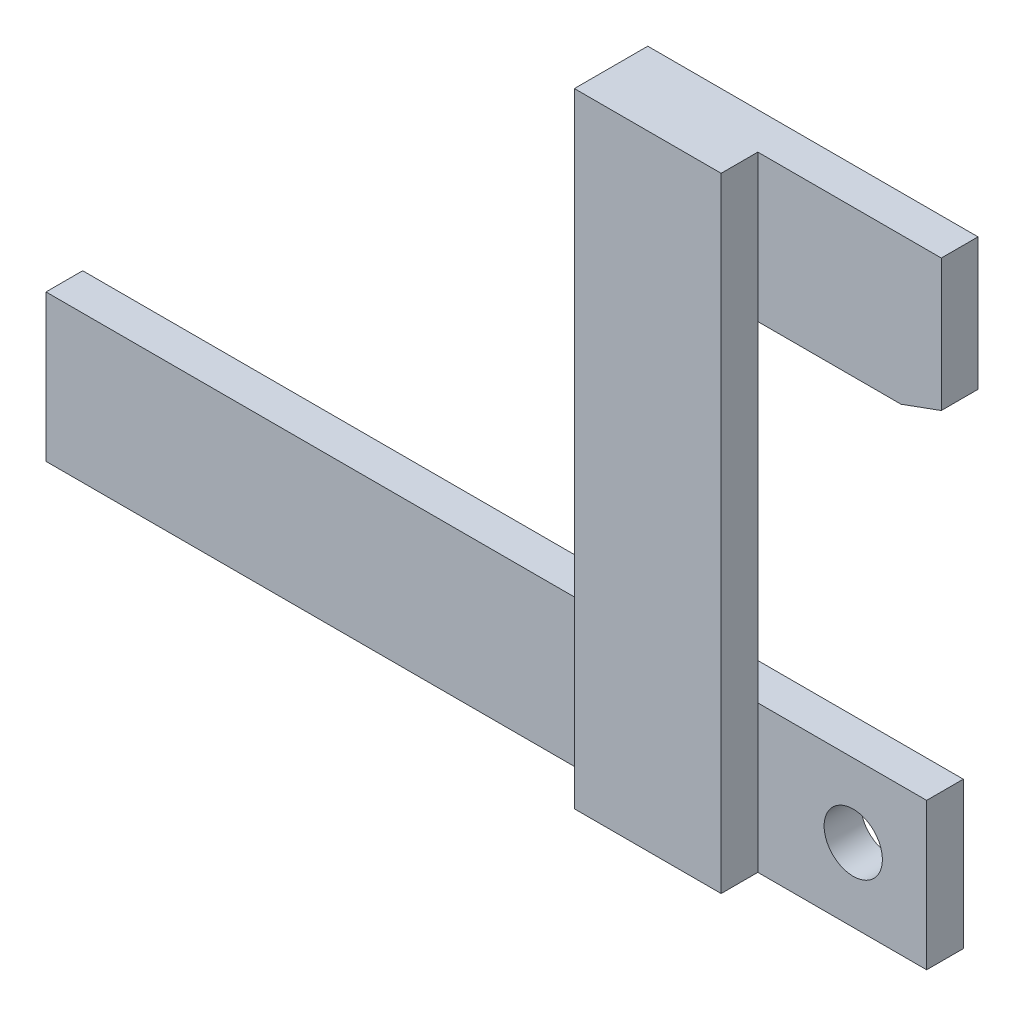
ISO-10303-21;
HEADER;
FILE_DESCRIPTION(('STEP AP214'),'2;1');
FILE_NAME('part.step','',(''),(''),'','','');
FILE_SCHEMA(('AUTOMOTIVE_DESIGN { 1 0 10303 214 1 1 1 1 }'));
ENDSEC;
DATA;
#1=APPLICATION_CONTEXT('core data for automotive mechanical design processes');
#2=APPLICATION_PROTOCOL_DEFINITION('international standard','automotive_design',2000,#1);
#3=PRODUCT_CONTEXT('',#1,'mechanical');
#4=PRODUCT('Part','Part','',(#3));
#5=PRODUCT_RELATED_PRODUCT_CATEGORY('part','',(#4));
#6=PRODUCT_DEFINITION_FORMATION('','',#4);
#7=PRODUCT_DEFINITION_CONTEXT('part definition',#1,'design');
#8=PRODUCT_DEFINITION('design','',#6,#7);
#9=PRODUCT_DEFINITION_SHAPE('','',#8);
#10=(LENGTH_UNIT() NAMED_UNIT(*) SI_UNIT(.MILLI.,.METRE.));
#11=(NAMED_UNIT(*) PLANE_ANGLE_UNIT() SI_UNIT($,.RADIAN.));
#12=(NAMED_UNIT(*) SI_UNIT($,.STERADIAN.) SOLID_ANGLE_UNIT());
#13=UNCERTAINTY_MEASURE_WITH_UNIT(LENGTH_MEASURE(1.E-05),#10,'distance_accuracy_value','');
#14=(GEOMETRIC_REPRESENTATION_CONTEXT(3) GLOBAL_UNCERTAINTY_ASSIGNED_CONTEXT((#13)) GLOBAL_UNIT_ASSIGNED_CONTEXT((#10,
#11,#12)) REPRESENTATION_CONTEXT('',''));
#15=CARTESIAN_POINT('',(0.,0.,0.));
#16=DIRECTION('',(0.,0.,1.));
#17=DIRECTION('',(1.,0.,0.));
#18=AXIS2_PLACEMENT_3D('',#15,#16,#17);
#19=CARTESIAN_POINT('',(46.9900000000001,95.25,6.35));
#20=DIRECTION('',(0.,0.,1.));
#21=DIRECTION('',(1.,0.,0.));
#22=AXIS2_PLACEMENT_3D('',#19,#20,#21);
#23=PLANE('',#22);
#24=DIRECTION('',(-1.,0.,0.));
#25=VECTOR('',#24,1.);
#26=CARTESIAN_POINT('',(21.5900000000001,69.85,6.35));
#27=LINE('',#26,#25);
#28=CARTESIAN_POINT('',(46.9900000000001,69.85,6.35));
#29=VERTEX_POINT('',#28);
#30=CARTESIAN_POINT('',(21.5900000000001,69.85,6.35));
#31=VERTEX_POINT('',#30);
#32=EDGE_CURVE('E158',#29,#31,#27,.T.);
#33=ORIENTED_EDGE('',*,*,#32,.F.);
#34=DIRECTION('',(0.,1.,0.));
#35=VECTOR('',#34,1.);
#36=CARTESIAN_POINT('',(46.9900000000001,-12.7,6.35));
#37=LINE('',#36,#35);
#38=CARTESIAN_POINT('',(46.9900000000001,12.7,6.35));
#39=VERTEX_POINT('',#38);
#40=EDGE_CURVE('E176',#39,#29,#37,.T.);
#41=ORIENTED_EDGE('',*,*,#40,.F.);
#42=DIRECTION('',(-1.,0.,0.));
#43=VECTOR('',#42,1.);
#44=CARTESIAN_POINT('',(-76.1999999999999,12.7,6.35));
#45=LINE('',#44,#43);
#46=CARTESIAN_POINT('',(21.5900000000001,12.7,6.35));
#47=VERTEX_POINT('',#46);
#48=EDGE_CURVE('E248',#39,#47,#45,.T.);
#49=ORIENTED_EDGE('',*,*,#48,.T.);
#50=DIRECTION('',(0.,-1.,0.));
#51=VECTOR('',#50,1.);
#52=CARTESIAN_POINT('',(21.5900000000001,-12.7,6.35));
#53=LINE('',#52,#51);
#54=EDGE_CURVE('E181',#31,#47,#53,.T.);
#55=ORIENTED_EDGE('',*,*,#54,.F.);
#56=EDGE_LOOP('',(#33,#41,#49,#55));
#57=FACE_BOUND('',#56,.T.);
#58=ADVANCED_FACE('F33',(#57),#23,.F.);
#59=CARTESIAN_POINT('',(76.2,12.7,6.35));
#60=DIRECTION('',(0.,0.,-1.));
#61=DIRECTION('',(-1.,0.,0.));
#62=AXIS2_PLACEMENT_3D('',#59,#60,#61);
#63=PLANE('',#62);
#64=CARTESIAN_POINT('',(63.5000000000001,0.,6.35));
#65=DIRECTION('',(0.,0.,1.));
#66=DIRECTION('',(1.,0.,0.));
#67=AXIS2_PLACEMENT_3D('',#64,#65,#66);
#68=CIRCLE('',#67,5.0419);
#69=CARTESIAN_POINT('',(68.5419000000001,0.,6.35));
#70=VERTEX_POINT('',#69);
#71=EDGE_CURVE('E453',#70,#70,#68,.T.);
#72=ORIENTED_EDGE('',*,*,#71,.F.);
#73=EDGE_LOOP('',(#72));
#74=FACE_BOUND('',#73,.T.);
#75=CARTESIAN_POINT('',(46.99,-12.7,6.35));
#76=VERTEX_POINT('',#75);
#77=EDGE_CURVE('E190',#76,#39,#37,.T.);
#78=ORIENTED_EDGE('',*,*,#77,.F.);
#79=DIRECTION('',(1.,0.,0.));
#80=VECTOR('',#79,1.);
#81=CARTESIAN_POINT('',(-76.1999999999999,-12.7,6.35));
#82=LINE('',#81,#80);
#83=CARTESIAN_POINT('',(76.2000000000001,-12.7,6.35));
#84=VERTEX_POINT('',#83);
#85=EDGE_CURVE('E217',#76,#84,#82,.T.);
#86=ORIENTED_EDGE('',*,*,#85,.T.);
#87=DIRECTION('',(0.,1.,0.));
#88=VECTOR('',#87,1.);
#89=CARTESIAN_POINT('',(76.2000000000001,-12.7,6.35));
#90=LINE('',#89,#88);
#91=CARTESIAN_POINT('',(76.2000000000001,12.7,6.35));
#92=VERTEX_POINT('',#91);
#93=EDGE_CURVE('E239',#84,#92,#90,.T.);
#94=ORIENTED_EDGE('',*,*,#93,.T.);
#95=EDGE_CURVE('E244',#92,#39,#45,.T.);
#96=ORIENTED_EDGE('',*,*,#95,.T.);
#97=EDGE_LOOP('',(#78,#86,#94,#96));
#98=FACE_BOUND('',#97,.T.);
#99=ADVANCED_FACE('F281',(#74,#98),#63,.F.);
#100=CARTESIAN_POINT('',(21.5900000000001,-12.7,6.35));
#101=VERTEX_POINT('',#100);
#102=EDGE_CURVE('E205',#47,#101,#53,.T.);
#103=ORIENTED_EDGE('',*,*,#102,.F.);
#104=CARTESIAN_POINT('',(-76.1999999999999,12.7,6.35));
#105=VERTEX_POINT('',#104);
#106=EDGE_CURVE('E242',#47,#105,#45,.T.);
#107=ORIENTED_EDGE('',*,*,#106,.T.);
#108=DIRECTION('',(0.,-1.,0.));
#109=VECTOR('',#108,1.);
#110=CARTESIAN_POINT('',(-76.1999999999999,-12.7,6.35));
#111=LINE('',#110,#109);
#112=CARTESIAN_POINT('',(-76.1999999999999,-12.7,6.35));
#113=VERTEX_POINT('',#112);
#114=EDGE_CURVE('E247',#105,#113,#111,.T.);
#115=ORIENTED_EDGE('',*,*,#114,.T.);
#116=EDGE_CURVE('E225',#113,#101,#82,.T.);
#117=ORIENTED_EDGE('',*,*,#116,.T.);
#118=EDGE_LOOP('',(#103,#107,#115,#117));
#119=FACE_BOUND('',#118,.T.);
#120=ADVANCED_FACE('F309',(#119),#63,.F.);
#121=CARTESIAN_POINT('',(76.2000000000001,-12.7,6.35));
#122=DIRECTION('',(-1.,0.,0.));
#123=DIRECTION('',(0.,0.,1.));
#124=AXIS2_PLACEMENT_3D('',#121,#122,#123);
#125=PLANE('',#124);
#126=DIRECTION('',(0.,1.,0.));
#127=VECTOR('',#126,1.);
#128=CARTESIAN_POINT('',(76.2000000000001,-12.7,0.));
#129=LINE('',#128,#127);
#130=CARTESIAN_POINT('',(76.2000000000001,-12.7,0.));
#131=VERTEX_POINT('',#130);
#132=CARTESIAN_POINT('',(76.2000000000001,12.7,0.));
#133=VERTEX_POINT('',#132);
#134=EDGE_CURVE('E233',#131,#133,#129,.T.);
#135=ORIENTED_EDGE('',*,*,#134,.T.);
#136=DIRECTION('',(0.,0.,-1.));
#137=VECTOR('',#136,1.);
#138=CARTESIAN_POINT('',(76.2000000000001,12.7,6.35));
#139=LINE('',#138,#137);
#140=EDGE_CURVE('E209',#92,#133,#139,.T.);
#141=ORIENTED_EDGE('',*,*,#140,.F.);
#142=ORIENTED_EDGE('',*,*,#93,.F.);
#143=DIRECTION('',(0.,0.,-1.));
#144=VECTOR('',#143,1.);
#145=CARTESIAN_POINT('',(76.2000000000001,-12.7,6.35));
#146=LINE('',#145,#144);
#147=EDGE_CURVE('E252',#84,#131,#146,.T.);
#148=ORIENTED_EDGE('',*,*,#147,.T.);
#149=EDGE_LOOP('',(#135,#141,#142,#148));
#150=FACE_BOUND('',#149,.T.);
#151=ADVANCED_FACE('F279',(#150),#125,.F.);
#152=CARTESIAN_POINT('',(-76.1999999999999,12.7,6.35));
#153=DIRECTION('',(0.,-1.,0.));
#154=DIRECTION('',(0.,0.,-1.));
#155=AXIS2_PLACEMENT_3D('',#152,#153,#154);
#156=PLANE('',#155);
#157=DIRECTION('',(-1.,0.,0.));
#158=VECTOR('',#157,1.);
#159=CARTESIAN_POINT('',(-76.1999999999999,12.7,0.));
#160=LINE('',#159,#158);
#161=CARTESIAN_POINT('',(-76.1999999999999,12.7,0.));
#162=VERTEX_POINT('',#161);
#163=EDGE_CURVE('E236',#133,#162,#160,.T.);
#164=ORIENTED_EDGE('',*,*,#163,.T.);
#165=DIRECTION('',(0.,0.,-1.));
#166=VECTOR('',#165,1.);
#167=CARTESIAN_POINT('',(-76.1999999999999,12.7,6.35));
#168=LINE('',#167,#166);
#169=EDGE_CURVE('E214',#105,#162,#168,.T.);
#170=ORIENTED_EDGE('',*,*,#169,.F.);
#171=ORIENTED_EDGE('',*,*,#106,.F.);
#172=ORIENTED_EDGE('',*,*,#48,.F.);
#173=ORIENTED_EDGE('',*,*,#95,.F.);
#174=ORIENTED_EDGE('',*,*,#140,.T.);
#175=EDGE_LOOP('',(#164,#170,#171,#172,#173,#174));
#176=FACE_BOUND('',#175,.T.);
#177=ADVANCED_FACE('F264',(#176),#156,.F.);
#178=CARTESIAN_POINT('',(-76.1999999999999,-12.7,6.35));
#179=DIRECTION('',(1.,0.,0.));
#180=DIRECTION('',(0.,0.,-1.));
#181=AXIS2_PLACEMENT_3D('',#178,#179,#180);
#182=PLANE('',#181);
#183=DIRECTION('',(0.,-1.,0.));
#184=VECTOR('',#183,1.);
#185=CARTESIAN_POINT('',(-76.1999999999999,-12.7,0.));
#186=LINE('',#185,#184);
#187=CARTESIAN_POINT('',(-76.1999999999999,-12.7,0.));
#188=VERTEX_POINT('',#187);
#189=EDGE_CURVE('E261',#162,#188,#186,.T.);
#190=ORIENTED_EDGE('',*,*,#189,.T.);
#191=DIRECTION('',(0.,0.,-1.));
#192=VECTOR('',#191,1.);
#193=CARTESIAN_POINT('',(-76.1999999999999,-12.7,6.35));
#194=LINE('',#193,#192);
#195=EDGE_CURVE('E256',#113,#188,#194,.T.);
#196=ORIENTED_EDGE('',*,*,#195,.F.);
#197=ORIENTED_EDGE('',*,*,#114,.F.);
#198=ORIENTED_EDGE('',*,*,#169,.T.);
#199=EDGE_LOOP('',(#190,#196,#197,#198));
#200=FACE_BOUND('',#199,.T.);
#201=ADVANCED_FACE('F272',(#200),#182,.F.);
#202=CARTESIAN_POINT('',(-76.1999999999999,-12.7,6.35));
#203=DIRECTION('',(0.,1.,0.));
#204=DIRECTION('',(0.,0.,1.));
#205=AXIS2_PLACEMENT_3D('',#202,#203,#204);
#206=PLANE('',#205);
#207=DIRECTION('',(1.,0.,0.));
#208=VECTOR('',#207,1.);
#209=CARTESIAN_POINT('',(-76.1999999999999,-12.7,0.));
#210=LINE('',#209,#208);
#211=EDGE_CURVE('E243',#188,#131,#210,.T.);
#212=ORIENTED_EDGE('',*,*,#211,.T.);
#213=ORIENTED_EDGE('',*,*,#147,.F.);
#214=ORIENTED_EDGE('',*,*,#85,.F.);
#215=DIRECTION('',(0.,0.,-1.));
#216=VECTOR('',#215,1.);
#217=CARTESIAN_POINT('',(46.9900000000001,-12.7,12.7));
#218=LINE('',#217,#216);
#219=CARTESIAN_POINT('',(46.9900000000001,-12.7,12.7));
#220=VERTEX_POINT('',#219);
#221=EDGE_CURVE('E186',#220,#76,#218,.T.);
#222=ORIENTED_EDGE('',*,*,#221,.F.);
#223=DIRECTION('',(1.,0.,0.));
#224=VECTOR('',#223,1.);
#225=CARTESIAN_POINT('',(46.9900000000001,-12.7,12.7));
#226=LINE('',#225,#224);
#227=CARTESIAN_POINT('',(21.5900000000001,-12.7,12.7));
#228=VERTEX_POINT('',#227);
#229=EDGE_CURVE('E184',#228,#220,#226,.T.);
#230=ORIENTED_EDGE('',*,*,#229,.F.);
#231=DIRECTION('',(0.,0.,-1.));
#232=VECTOR('',#231,1.);
#233=CARTESIAN_POINT('',(21.5900000000001,-12.7,12.7));
#234=LINE('',#233,#232);
#235=EDGE_CURVE('E141',#228,#101,#234,.T.);
#236=ORIENTED_EDGE('',*,*,#235,.T.);
#237=ORIENTED_EDGE('',*,*,#116,.F.);
#238=ORIENTED_EDGE('',*,*,#195,.T.);
#239=EDGE_LOOP('',(#212,#213,#214,#222,#230,#236,#237,#238));
#240=FACE_BOUND('',#239,.T.);
#241=ADVANCED_FACE('F223',(#240),#206,.F.);
#242=CARTESIAN_POINT('',(76.2,12.7,0.));
#243=DIRECTION('',(0.,0.,-1.));
#244=DIRECTION('',(-1.,0.,0.));
#245=AXIS2_PLACEMENT_3D('',#242,#243,#244);
#246=PLANE('',#245);
#247=CARTESIAN_POINT('',(63.5000000000001,0.,0.));
#248=DIRECTION('',(0.,0.,-1.));
#249=DIRECTION('',(-1.,0.,0.));
#250=AXIS2_PLACEMENT_3D('',#247,#248,#249);
#251=CIRCLE('',#250,5.04189999999999);
#252=CARTESIAN_POINT('',(58.4581000000001,0.,0.));
#253=VERTEX_POINT('',#252);
#254=EDGE_CURVE('E161',#253,#253,#251,.T.);
#255=ORIENTED_EDGE('',*,*,#254,.F.);
#256=EDGE_LOOP('',(#255));
#257=FACE_BOUND('',#256,.T.);
#258=ORIENTED_EDGE('',*,*,#134,.F.);
#259=ORIENTED_EDGE('',*,*,#211,.F.);
#260=ORIENTED_EDGE('',*,*,#189,.F.);
#261=ORIENTED_EDGE('',*,*,#163,.F.);
#262=EDGE_LOOP('',(#258,#259,#260,#261));
#263=FACE_BOUND('',#262,.T.);
#264=ADVANCED_FACE('F275',(#257,#263),#246,.T.);
#265=CARTESIAN_POINT('',(46.9900000000001,-12.7,12.7));
#266=DIRECTION('',(-1.,0.,0.));
#267=DIRECTION('',(0.,0.,1.));
#268=AXIS2_PLACEMENT_3D('',#265,#266,#267);
#269=PLANE('',#268);
#270=ORIENTED_EDGE('',*,*,#77,.T.);
#271=ORIENTED_EDGE('',*,*,#40,.T.);
#272=DIRECTION('',(0.,1.,0.));
#273=VECTOR('',#272,1.);
#274=CARTESIAN_POINT('',(46.9900000000001,-12.7,6.35));
#275=LINE('',#274,#273);
#276=CARTESIAN_POINT('',(46.9900000000001,95.25,6.35));
#277=VERTEX_POINT('',#276);
#278=EDGE_CURVE('E173',#29,#277,#275,.T.);
#279=ORIENTED_EDGE('',*,*,#278,.T.);
#280=DIRECTION('',(0.,0.,-1.));
#281=VECTOR('',#280,1.);
#282=CARTESIAN_POINT('',(46.9900000000001,95.25,12.7));
#283=LINE('',#282,#281);
#284=CARTESIAN_POINT('',(46.9900000000001,95.25,12.7));
#285=VERTEX_POINT('',#284);
#286=EDGE_CURVE('E140',#285,#277,#283,.T.);
#287=ORIENTED_EDGE('',*,*,#286,.F.);
#288=DIRECTION('',(0.,1.,0.));
#289=VECTOR('',#288,1.);
#290=CARTESIAN_POINT('',(46.9900000000001,-12.7,12.7));
#291=LINE('',#290,#289);
#292=EDGE_CURVE('E177',#220,#285,#291,.T.);
#293=ORIENTED_EDGE('',*,*,#292,.F.);
#294=ORIENTED_EDGE('',*,*,#221,.T.);
#295=EDGE_LOOP('',(#270,#271,#279,#287,#293,#294));
#296=FACE_BOUND('',#295,.T.);
#297=ADVANCED_FACE('F283',(#296),#269,.F.);
#298=CARTESIAN_POINT('',(46.9900000000001,95.25,12.7));
#299=DIRECTION('',(0.,-1.,0.));
#300=DIRECTION('',(0.,0.,-1.));
#301=AXIS2_PLACEMENT_3D('',#298,#299,#300);
#302=PLANE('',#301);
#303=ORIENTED_EDGE('',*,*,#286,.T.);
#304=DIRECTION('',(1.,0.,0.));
#305=VECTOR('',#304,1.);
#306=CARTESIAN_POINT('',(21.5900000000001,95.25,6.35));
#307=LINE('',#306,#305);
#308=CARTESIAN_POINT('',(78.7400000000001,95.25,6.35));
#309=VERTEX_POINT('',#308);
#310=EDGE_CURVE('E167',#277,#309,#307,.T.);
#311=ORIENTED_EDGE('',*,*,#310,.T.);
#312=DIRECTION('',(0.,0.,1.));
#313=VECTOR('',#312,1.);
#314=CARTESIAN_POINT('',(78.7400000000001,95.25,0.));
#315=LINE('',#314,#313);
#316=CARTESIAN_POINT('',(78.7400000000001,95.25,0.));
#317=VERTEX_POINT('',#316);
#318=EDGE_CURVE('E148',#317,#309,#315,.T.);
#319=ORIENTED_EDGE('',*,*,#318,.F.);
#320=DIRECTION('',(1.,0.,0.));
#321=VECTOR('',#320,1.);
#322=CARTESIAN_POINT('',(21.5900000000001,95.25,0.));
#323=LINE('',#322,#321);
#324=CARTESIAN_POINT('',(21.5900000000001,95.25,0.));
#325=VERTEX_POINT('',#324);
#326=EDGE_CURVE('E144',#325,#317,#323,.T.);
#327=ORIENTED_EDGE('',*,*,#326,.F.);
#328=DIRECTION('',(0.,0.,-1.));
#329=VECTOR('',#328,1.);
#330=CARTESIAN_POINT('',(21.5900000000001,95.25,12.7));
#331=LINE('',#330,#329);
#332=CARTESIAN_POINT('',(21.5900000000001,95.25,12.7));
#333=VERTEX_POINT('',#332);
#334=EDGE_CURVE('E132',#333,#325,#331,.T.);
#335=ORIENTED_EDGE('',*,*,#334,.F.);
#336=DIRECTION('',(-1.,0.,0.));
#337=VECTOR('',#336,1.);
#338=CARTESIAN_POINT('',(46.9900000000001,95.25,12.7));
#339=LINE('',#338,#337);
#340=EDGE_CURVE('E180',#285,#333,#339,.T.);
#341=ORIENTED_EDGE('',*,*,#340,.F.);
#342=EDGE_LOOP('',(#303,#311,#319,#327,#335,#341));
#343=FACE_BOUND('',#342,.T.);
#344=ADVANCED_FACE('F146',(#343),#302,.F.);
#345=CARTESIAN_POINT('',(21.5900000000001,-12.7,12.7));
#346=DIRECTION('',(1.,0.,0.));
#347=DIRECTION('',(0.,0.,-1.));
#348=AXIS2_PLACEMENT_3D('',#345,#346,#347);
#349=PLANE('',#348);
#350=ORIENTED_EDGE('',*,*,#334,.T.);
#351=DIRECTION('',(0.,1.,0.));
#352=VECTOR('',#351,1.);
#353=CARTESIAN_POINT('',(21.5900000000001,95.25,0.));
#354=LINE('',#353,#352);
#355=CARTESIAN_POINT('',(21.5900000000001,69.85,0.));
#356=VERTEX_POINT('',#355);
#357=EDGE_CURVE('E136',#356,#325,#354,.T.);
#358=ORIENTED_EDGE('',*,*,#357,.F.);
#359=DIRECTION('',(0.,0.,1.));
#360=VECTOR('',#359,1.);
#361=CARTESIAN_POINT('',(21.5900000000001,69.85,0.));
#362=LINE('',#361,#360);
#363=EDGE_CURVE('E166',#356,#31,#362,.T.);
#364=ORIENTED_EDGE('',*,*,#363,.T.);
#365=ORIENTED_EDGE('',*,*,#54,.T.);
#366=ORIENTED_EDGE('',*,*,#102,.T.);
#367=ORIENTED_EDGE('',*,*,#235,.F.);
#368=DIRECTION('',(0.,-1.,0.));
#369=VECTOR('',#368,1.);
#370=CARTESIAN_POINT('',(21.5900000000001,-12.7,12.7));
#371=LINE('',#370,#369);
#372=EDGE_CURVE('E138',#333,#228,#371,.T.);
#373=ORIENTED_EDGE('',*,*,#372,.F.);
#374=EDGE_LOOP('',(#350,#358,#364,#365,#366,#367,#373));
#375=FACE_BOUND('',#374,.T.);
#376=ADVANCED_FACE('F134',(#375),#349,.F.);
#377=CARTESIAN_POINT('',(46.9900000000001,95.25,12.7));
#378=DIRECTION('',(0.,0.,1.));
#379=DIRECTION('',(1.,0.,0.));
#380=AXIS2_PLACEMENT_3D('',#377,#378,#379);
#381=PLANE('',#380);
#382=ORIENTED_EDGE('',*,*,#292,.T.);
#383=ORIENTED_EDGE('',*,*,#340,.T.);
#384=ORIENTED_EDGE('',*,*,#372,.T.);
#385=ORIENTED_EDGE('',*,*,#229,.T.);
#386=EDGE_LOOP('',(#382,#383,#384,#385));
#387=FACE_BOUND('',#386,.T.);
#388=ADVANCED_FACE('F230',(#387),#381,.T.);
#389=CARTESIAN_POINT('',(21.5900000000001,69.85,6.35));
#390=DIRECTION('',(0.,0.,1.));
#391=DIRECTION('',(1.,0.,0.));
#392=AXIS2_PLACEMENT_3D('',#389,#390,#391);
#393=PLANE('',#392);
#394=CARTESIAN_POINT('',(71.7614073545854,69.85,6.35));
#395=VERTEX_POINT('',#394);
#396=EDGE_CURVE('E156',#395,#29,#27,.T.);
#397=ORIENTED_EDGE('',*,*,#396,.F.);
#398=DIRECTION('',(-0.939692620785907,-0.342020143325672,0.));
#399=VECTOR('',#398,1.);
#400=CARTESIAN_POINT('',(27.4589397735735,53.7252204959681,6.35));
#401=LINE('',#400,#399);
#402=CARTESIAN_POINT('',(78.7400000000001,72.39,6.35));
#403=VERTEX_POINT('',#402);
#404=EDGE_CURVE('E55',#395,#403,#401,.F.);
#405=ORIENTED_EDGE('',*,*,#404,.T.);
#406=DIRECTION('',(0.,-1.,0.));
#407=VECTOR('',#406,1.);
#408=CARTESIAN_POINT('',(78.7400000000001,95.25,6.35));
#409=LINE('',#408,#407);
#410=EDGE_CURVE('E169',#309,#403,#409,.T.);
#411=ORIENTED_EDGE('',*,*,#410,.F.);
#412=ORIENTED_EDGE('',*,*,#310,.F.);
#413=ORIENTED_EDGE('',*,*,#278,.F.);
#414=EDGE_LOOP('',(#397,#405,#411,#412,#413));
#415=FACE_BOUND('',#414,.T.);
#416=ADVANCED_FACE('F291',(#415),#393,.T.);
#417=CARTESIAN_POINT('',(78.7400000000001,95.25,0.));
#418=DIRECTION('',(-1.,0.,0.));
#419=DIRECTION('',(0.,0.,1.));
#420=AXIS2_PLACEMENT_3D('',#417,#418,#419);
#421=PLANE('',#420);
#422=ORIENTED_EDGE('',*,*,#410,.T.);
#423=DIRECTION('',(0.,0.,-1.));
#424=VECTOR('',#423,1.);
#425=CARTESIAN_POINT('',(78.7400000000001,72.39,0.));
#426=LINE('',#425,#424);
#427=CARTESIAN_POINT('',(78.7400000000001,72.39,0.));
#428=VERTEX_POINT('',#427);
#429=EDGE_CURVE('E41',#403,#428,#426,.T.);
#430=ORIENTED_EDGE('',*,*,#429,.T.);
#431=DIRECTION('',(0.,-1.,0.));
#432=VECTOR('',#431,1.);
#433=CARTESIAN_POINT('',(78.7400000000001,95.25,0.));
#434=LINE('',#433,#432);
#435=EDGE_CURVE('E150',#317,#428,#434,.T.);
#436=ORIENTED_EDGE('',*,*,#435,.F.);
#437=ORIENTED_EDGE('',*,*,#318,.T.);
#438=EDGE_LOOP('',(#422,#430,#436,#437));
#439=FACE_BOUND('',#438,.T.);
#440=ADVANCED_FACE('F292',(#439),#421,.F.);
#441=CARTESIAN_POINT('',(21.5900000000001,69.85,0.));
#442=DIRECTION('',(0.,1.,0.));
#443=DIRECTION('',(-1.,0.,0.));
#444=AXIS2_PLACEMENT_3D('',#441,#442,#443);
#445=PLANE('',#444);
#446=DIRECTION('',(-1.,0.,0.));
#447=VECTOR('',#446,1.);
#448=CARTESIAN_POINT('',(21.5900000000001,69.85,0.));
#449=LINE('',#448,#447);
#450=CARTESIAN_POINT('',(71.7614073545853,69.85,0.));
#451=VERTEX_POINT('',#450);
#452=EDGE_CURVE('E154',#451,#356,#449,.T.);
#453=ORIENTED_EDGE('',*,*,#452,.F.);
#454=DIRECTION('',(0.,0.,1.));
#455=VECTOR('',#454,1.);
#456=CARTESIAN_POINT('',(71.7614073545854,69.85,0.));
#457=LINE('',#456,#455);
#458=EDGE_CURVE('E202',#451,#395,#457,.T.);
#459=ORIENTED_EDGE('',*,*,#458,.T.);
#460=ORIENTED_EDGE('',*,*,#396,.T.);
#461=ORIENTED_EDGE('',*,*,#32,.T.);
#462=ORIENTED_EDGE('',*,*,#363,.F.);
#463=EDGE_LOOP('',(#453,#459,#460,#461,#462));
#464=FACE_BOUND('',#463,.T.);
#465=ADVANCED_FACE('F290',(#464),#445,.F.);
#466=CARTESIAN_POINT('',(21.5900000000001,69.85,0.));
#467=DIRECTION('',(0.,0.,1.));
#468=DIRECTION('',(1.,0.,0.));
#469=AXIS2_PLACEMENT_3D('',#466,#467,#468);
#470=PLANE('',#469);
#471=ORIENTED_EDGE('',*,*,#435,.T.);
#472=DIRECTION('',(0.939692620785907,0.342020143325672,0.));
#473=VECTOR('',#472,1.);
#474=CARTESIAN_POINT('',(71.7614073545854,69.85,0.));
#475=LINE('',#474,#473);
#476=EDGE_CURVE('E11',#428,#451,#475,.F.);
#477=ORIENTED_EDGE('',*,*,#476,.T.);
#478=ORIENTED_EDGE('',*,*,#452,.T.);
#479=ORIENTED_EDGE('',*,*,#357,.T.);
#480=ORIENTED_EDGE('',*,*,#326,.T.);
#481=EDGE_LOOP('',(#471,#477,#478,#479,#480));
#482=FACE_BOUND('',#481,.T.);
#483=ADVANCED_FACE('F152',(#482),#470,.F.);
#484=CARTESIAN_POINT('',(71.7614073545854,69.85,0.));
#485=DIRECTION('',(-0.342020143325672,0.939692620785907,0.));
#486=DIRECTION('',(-0.939692620785907,-0.342020143325672,0.));
#487=AXIS2_PLACEMENT_3D('',#484,#485,#486);
#488=PLANE('',#487);
#489=ORIENTED_EDGE('',*,*,#476,.F.);
#490=ORIENTED_EDGE('',*,*,#429,.F.);
#491=ORIENTED_EDGE('',*,*,#404,.F.);
#492=ORIENTED_EDGE('',*,*,#458,.F.);
#493=EDGE_LOOP('',(#489,#490,#491,#492));
#494=FACE_BOUND('',#493,.T.);
#495=ADVANCED_FACE('F35',(#494),#488,.F.);
#496=CARTESIAN_POINT('',(63.5000000000001,0.,6.35));
#497=DIRECTION('',(0.,0.,1.));
#498=DIRECTION('',(1.,0.,0.));
#499=AXIS2_PLACEMENT_3D('',#496,#497,#498);
#500=CYLINDRICAL_SURFACE('',#499,5.04189999999999);
#501=ORIENTED_EDGE('',*,*,#254,.T.);
#502=EDGE_LOOP('',(#501));
#503=FACE_BOUND('',#502,.T.);
#504=ORIENTED_EDGE('',*,*,#71,.T.);
#505=EDGE_LOOP('',(#504));
#506=FACE_BOUND('',#505,.T.);
#507=ADVANCED_FACE('F296',(#503,#506),#500,.F.);
#508=CLOSED_SHELL('',(#58,#99,#120,#151,#177,#201,#241,#264,#297,#344,#376,#388,#416,#440,#465,
#483,#495,#507));
#509=MANIFOLD_SOLID_BREP('B2',#508);
#510=ADVANCED_BREP_SHAPE_REPRESENTATION('',(#18,#509),#14);
#511=SHAPE_DEFINITION_REPRESENTATION(#9,#510);
ENDSEC;
END-ISO-10303-21;
